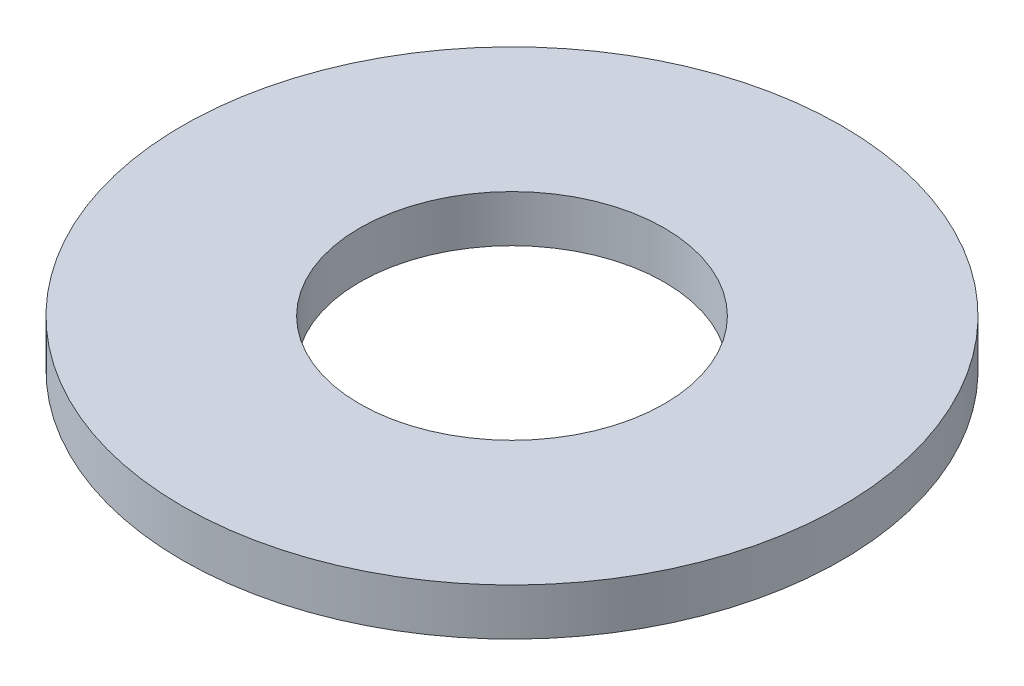
ISO-10303-21;
HEADER;
FILE_DESCRIPTION(('STEP AP214'),'2;1');
FILE_NAME('part.step','',(''),(''),'','','');
FILE_SCHEMA(('AUTOMOTIVE_DESIGN { 1 0 10303 214 1 1 1 1 }'));
ENDSEC;
DATA;
#1=APPLICATION_CONTEXT('core data for automotive mechanical design processes');
#2=APPLICATION_PROTOCOL_DEFINITION('international standard','automotive_design',2000,#1);
#3=PRODUCT_CONTEXT('',#1,'mechanical');
#4=PRODUCT('Part','Part','',(#3));
#5=PRODUCT_RELATED_PRODUCT_CATEGORY('part','',(#4));
#6=PRODUCT_DEFINITION_FORMATION('','',#4);
#7=PRODUCT_DEFINITION_CONTEXT('part definition',#1,'design');
#8=PRODUCT_DEFINITION('design','',#6,#7);
#9=PRODUCT_DEFINITION_SHAPE('','',#8);
#10=(LENGTH_UNIT() NAMED_UNIT(*) SI_UNIT(.MILLI.,.METRE.));
#11=(NAMED_UNIT(*) PLANE_ANGLE_UNIT() SI_UNIT($,.RADIAN.));
#12=(NAMED_UNIT(*) SI_UNIT($,.STERADIAN.) SOLID_ANGLE_UNIT());
#13=UNCERTAINTY_MEASURE_WITH_UNIT(LENGTH_MEASURE(1.E-05),#10,'distance_accuracy_value','');
#14=(GEOMETRIC_REPRESENTATION_CONTEXT(3) GLOBAL_UNCERTAINTY_ASSIGNED_CONTEXT((#13)) GLOBAL_UNIT_ASSIGNED_CONTEXT((#10,
#11,#12)) REPRESENTATION_CONTEXT('',''));
#15=CARTESIAN_POINT('',(0.,0.,0.));
#16=DIRECTION('',(0.,0.,1.));
#17=DIRECTION('',(1.,0.,0.));
#18=AXIS2_PLACEMENT_3D('',#15,#16,#17);
#19=CARTESIAN_POINT('',(0.,0.254,0.));
#20=DIRECTION('',(0.,1.,0.));
#21=DIRECTION('',(0.,0.,1.));
#22=AXIS2_PLACEMENT_3D('',#19,#20,#21);
#23=PLANE('',#22);
#24=CARTESIAN_POINT('',(0.,0.254,0.));
#25=DIRECTION('',(0.,1.,0.));
#26=DIRECTION('',(0.,0.,1.));
#27=AXIS2_PLACEMENT_3D('',#24,#25,#26);
#28=CIRCLE('',#27,3.571875);
#29=CARTESIAN_POINT('',(0.,0.254,3.571875));
#30=VERTEX_POINT('',#29);
#31=EDGE_CURVE('E10',#30,#30,#28,.T.);
#32=ORIENTED_EDGE('',*,*,#31,.T.);
#33=EDGE_LOOP('',(#32));
#34=FACE_BOUND('',#33,.T.);
#35=CARTESIAN_POINT('',(0.,0.254,0.));
#36=DIRECTION('',(0.,1.,0.));
#37=DIRECTION('',(0.,0.,1.));
#38=AXIS2_PLACEMENT_3D('',#35,#36,#37);
#39=CIRCLE('',#38,1.651);
#40=CARTESIAN_POINT('',(0.,0.254,1.651));
#41=VERTEX_POINT('',#40);
#42=EDGE_CURVE('E42',#41,#41,#39,.T.);
#43=ORIENTED_EDGE('',*,*,#42,.F.);
#44=EDGE_LOOP('',(#43));
#45=FACE_BOUND('',#44,.T.);
#46=ADVANCED_FACE('F31',(#34,#45),#23,.T.);
#47=CARTESIAN_POINT('',(0.,-0.254,0.));
#48=DIRECTION('',(0.,1.,0.));
#49=DIRECTION('',(0.,0.,1.));
#50=AXIS2_PLACEMENT_3D('',#47,#48,#49);
#51=PLANE('',#50);
#52=CARTESIAN_POINT('',(0.,-0.254,0.));
#53=DIRECTION('',(0.,1.,0.));
#54=DIRECTION('',(0.,0.,1.));
#55=AXIS2_PLACEMENT_3D('',#52,#53,#54);
#56=CIRCLE('',#55,3.571875);
#57=CARTESIAN_POINT('',(0.,-0.254,3.571875));
#58=VERTEX_POINT('',#57);
#59=EDGE_CURVE('E35',#58,#58,#56,.T.);
#60=ORIENTED_EDGE('',*,*,#59,.F.);
#61=EDGE_LOOP('',(#60));
#62=FACE_BOUND('',#61,.T.);
#63=CARTESIAN_POINT('',(0.,-0.254,0.));
#64=DIRECTION('',(0.,1.,0.));
#65=DIRECTION('',(0.,0.,1.));
#66=AXIS2_PLACEMENT_3D('',#63,#64,#65);
#67=CIRCLE('',#66,1.651);
#68=CARTESIAN_POINT('',(0.,-0.254,1.651));
#69=VERTEX_POINT('',#68);
#70=EDGE_CURVE('E44',#69,#69,#67,.T.);
#71=ORIENTED_EDGE('',*,*,#70,.T.);
#72=EDGE_LOOP('',(#71));
#73=FACE_BOUND('',#72,.T.);
#74=ADVANCED_FACE('F54',(#62,#73),#51,.F.);
#75=CARTESIAN_POINT('',(0.,0.254,0.));
#76=DIRECTION('',(0.,-1.,0.));
#77=DIRECTION('',(0.,0.,-1.));
#78=AXIS2_PLACEMENT_3D('',#75,#76,#77);
#79=CYLINDRICAL_SURFACE('',#78,3.571875);
#80=ORIENTED_EDGE('',*,*,#31,.F.);
#81=EDGE_LOOP('',(#80));
#82=FACE_BOUND('',#81,.T.);
#83=ORIENTED_EDGE('',*,*,#59,.T.);
#84=EDGE_LOOP('',(#83));
#85=FACE_BOUND('',#84,.T.);
#86=ADVANCED_FACE('F33',(#82,#85),#79,.T.);
#87=CARTESIAN_POINT('',(0.,0.254,0.));
#88=DIRECTION('',(0.,-1.,0.));
#89=DIRECTION('',(0.,0.,-1.));
#90=AXIS2_PLACEMENT_3D('',#87,#88,#89);
#91=CYLINDRICAL_SURFACE('',#90,1.651);
#92=ORIENTED_EDGE('',*,*,#42,.T.);
#93=EDGE_LOOP('',(#92));
#94=FACE_BOUND('',#93,.T.);
#95=ORIENTED_EDGE('',*,*,#70,.F.);
#96=EDGE_LOOP('',(#95));
#97=FACE_BOUND('',#96,.T.);
#98=ADVANCED_FACE('F50',(#94,#97),#91,.F.);
#99=CLOSED_SHELL('',(#46,#74,#86,#98));
#100=MANIFOLD_SOLID_BREP('B2',#99);
#101=ADVANCED_BREP_SHAPE_REPRESENTATION('',(#18,#100),#14);
#102=SHAPE_DEFINITION_REPRESENTATION(#9,#101);
ENDSEC;
END-ISO-10303-21;
